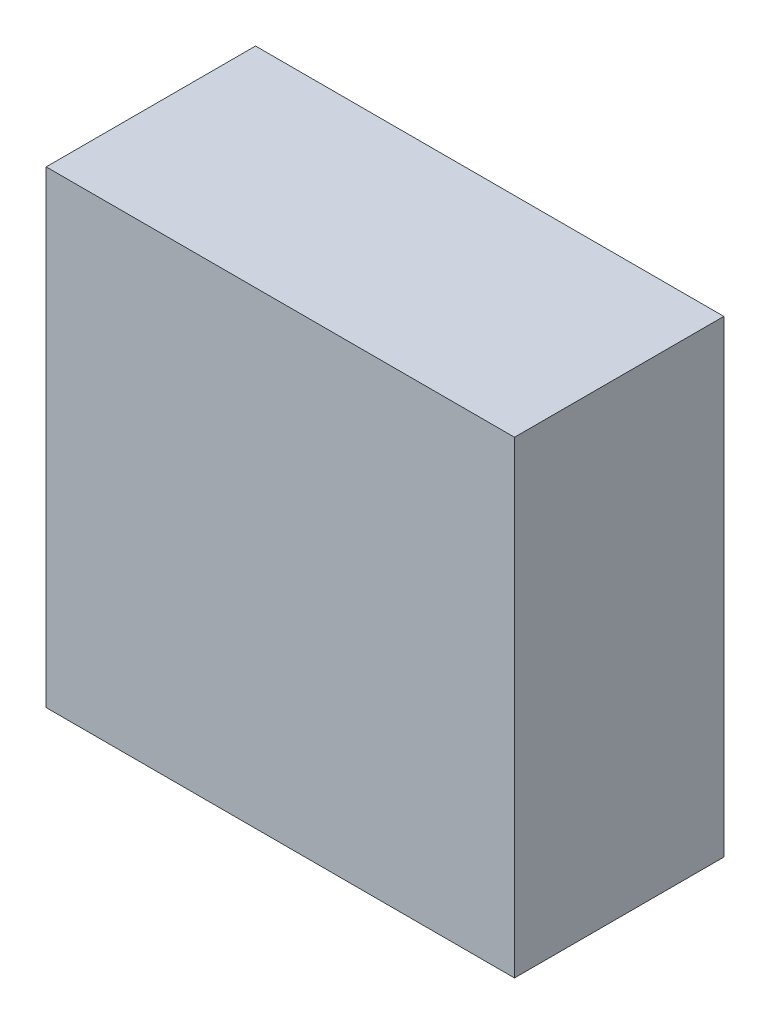
ISO-10303-21;
HEADER;
FILE_DESCRIPTION(('STEP AP214'),'2;1');
FILE_NAME('part.step','',(''),(''),'','','');
FILE_SCHEMA(('AUTOMOTIVE_DESIGN { 1 0 10303 214 1 1 1 1 }'));
ENDSEC;
DATA;
#1=APPLICATION_CONTEXT('core data for automotive mechanical design processes');
#2=APPLICATION_PROTOCOL_DEFINITION('international standard','automotive_design',2000,#1);
#3=PRODUCT_CONTEXT('',#1,'mechanical');
#4=PRODUCT('Part','Part','',(#3));
#5=PRODUCT_RELATED_PRODUCT_CATEGORY('part','',(#4));
#6=PRODUCT_DEFINITION_FORMATION('','',#4);
#7=PRODUCT_DEFINITION_CONTEXT('part definition',#1,'design');
#8=PRODUCT_DEFINITION('design','',#6,#7);
#9=PRODUCT_DEFINITION_SHAPE('','',#8);
#10=(LENGTH_UNIT() NAMED_UNIT(*) SI_UNIT(.MILLI.,.METRE.));
#11=(NAMED_UNIT(*) PLANE_ANGLE_UNIT() SI_UNIT($,.RADIAN.));
#12=(NAMED_UNIT(*) SI_UNIT($,.STERADIAN.) SOLID_ANGLE_UNIT());
#13=UNCERTAINTY_MEASURE_WITH_UNIT(LENGTH_MEASURE(1.E-05),#10,'distance_accuracy_value','');
#14=(GEOMETRIC_REPRESENTATION_CONTEXT(3) GLOBAL_UNCERTAINTY_ASSIGNED_CONTEXT((#13)) GLOBAL_UNIT_ASSIGNED_CONTEXT((#10,
#11,#12)) REPRESENTATION_CONTEXT('',''));
#15=CARTESIAN_POINT('',(0.,0.,0.));
#16=DIRECTION('',(0.,0.,1.));
#17=DIRECTION('',(1.,0.,0.));
#18=AXIS2_PLACEMENT_3D('',#15,#16,#17);
#19=CARTESIAN_POINT('',(-11.185,-11.185,10.));
#20=DIRECTION('',(1.,0.,0.));
#21=DIRECTION('',(0.,0.,-1.));
#22=AXIS2_PLACEMENT_3D('',#19,#20,#21);
#23=PLANE('',#22);
#24=DIRECTION('',(0.,-1.,0.));
#25=VECTOR('',#24,1.);
#26=CARTESIAN_POINT('',(-11.185,-11.185,0.));
#27=LINE('',#26,#25);
#28=CARTESIAN_POINT('',(-11.185,11.185,0.));
#29=VERTEX_POINT('',#28);
#30=CARTESIAN_POINT('',(-11.185,-11.185,0.));
#31=VERTEX_POINT('',#30);
#32=EDGE_CURVE('E96',#29,#31,#27,.T.);
#33=ORIENTED_EDGE('',*,*,#32,.T.);
#34=DIRECTION('',(0.,0.,-1.));
#35=VECTOR('',#34,1.);
#36=CARTESIAN_POINT('',(-11.185,-11.185,10.));
#37=LINE('',#36,#35);
#38=CARTESIAN_POINT('',(-11.185,-11.185,10.));
#39=VERTEX_POINT('',#38);
#40=EDGE_CURVE('E11',#39,#31,#37,.T.);
#41=ORIENTED_EDGE('',*,*,#40,.F.);
#42=DIRECTION('',(0.,-1.,0.));
#43=VECTOR('',#42,1.);
#44=CARTESIAN_POINT('',(-11.185,-11.185,10.));
#45=LINE('',#44,#43);
#46=CARTESIAN_POINT('',(-11.185,11.185,10.));
#47=VERTEX_POINT('',#46);
#48=EDGE_CURVE('E84',#47,#39,#45,.T.);
#49=ORIENTED_EDGE('',*,*,#48,.F.);
#50=DIRECTION('',(0.,0.,-1.));
#51=VECTOR('',#50,1.);
#52=CARTESIAN_POINT('',(-11.185,11.185,10.));
#53=LINE('',#52,#51);
#54=EDGE_CURVE('E92',#47,#29,#53,.T.);
#55=ORIENTED_EDGE('',*,*,#54,.T.);
#56=EDGE_LOOP('',(#33,#41,#49,#55));
#57=FACE_BOUND('',#56,.T.);
#58=ADVANCED_FACE('F33',(#57),#23,.F.);
#59=CARTESIAN_POINT('',(11.185,-11.185,10.));
#60=DIRECTION('',(0.,1.,0.));
#61=DIRECTION('',(-1.,0.,0.));
#62=AXIS2_PLACEMENT_3D('',#59,#60,#61);
#63=PLANE('',#62);
#64=DIRECTION('',(1.,0.,0.));
#65=VECTOR('',#64,1.);
#66=CARTESIAN_POINT('',(11.185,-11.185,0.));
#67=LINE('',#66,#65);
#68=CARTESIAN_POINT('',(11.185,-11.185,0.));
#69=VERTEX_POINT('',#68);
#70=EDGE_CURVE('E88',#31,#69,#67,.T.);
#71=ORIENTED_EDGE('',*,*,#70,.T.);
#72=DIRECTION('',(0.,0.,-1.));
#73=VECTOR('',#72,1.);
#74=CARTESIAN_POINT('',(11.185,-11.185,10.));
#75=LINE('',#74,#73);
#76=CARTESIAN_POINT('',(11.185,-11.185,10.));
#77=VERTEX_POINT('',#76);
#78=EDGE_CURVE('E41',#77,#69,#75,.T.);
#79=ORIENTED_EDGE('',*,*,#78,.F.);
#80=DIRECTION('',(1.,0.,0.));
#81=VECTOR('',#80,1.);
#82=CARTESIAN_POINT('',(11.185,-11.185,10.));
#83=LINE('',#82,#81);
#84=EDGE_CURVE('E79',#39,#77,#83,.T.);
#85=ORIENTED_EDGE('',*,*,#84,.F.);
#86=ORIENTED_EDGE('',*,*,#40,.T.);
#87=EDGE_LOOP('',(#71,#79,#85,#86));
#88=FACE_BOUND('',#87,.T.);
#89=ADVANCED_FACE('F87',(#88),#63,.F.);
#90=CARTESIAN_POINT('',(11.185,-11.185,10.));
#91=DIRECTION('',(-1.,0.,0.));
#92=DIRECTION('',(0.,0.,1.));
#93=AXIS2_PLACEMENT_3D('',#90,#91,#92);
#94=PLANE('',#93);
#95=DIRECTION('',(0.,1.,0.));
#96=VECTOR('',#95,1.);
#97=CARTESIAN_POINT('',(11.185,-11.185,0.));
#98=LINE('',#97,#96);
#99=CARTESIAN_POINT('',(11.185,11.185,0.));
#100=VERTEX_POINT('',#99);
#101=EDGE_CURVE('E66',#69,#100,#98,.T.);
#102=ORIENTED_EDGE('',*,*,#101,.T.);
#103=DIRECTION('',(0.,0.,-1.));
#104=VECTOR('',#103,1.);
#105=CARTESIAN_POINT('',(11.185,11.185,10.));
#106=LINE('',#105,#104);
#107=CARTESIAN_POINT('',(11.185,11.185,10.));
#108=VERTEX_POINT('',#107);
#109=EDGE_CURVE('E89',#108,#100,#106,.T.);
#110=ORIENTED_EDGE('',*,*,#109,.F.);
#111=DIRECTION('',(0.,1.,0.));
#112=VECTOR('',#111,1.);
#113=CARTESIAN_POINT('',(11.185,-11.185,10.));
#114=LINE('',#113,#112);
#115=EDGE_CURVE('E82',#77,#108,#114,.T.);
#116=ORIENTED_EDGE('',*,*,#115,.F.);
#117=ORIENTED_EDGE('',*,*,#78,.T.);
#118=EDGE_LOOP('',(#102,#110,#116,#117));
#119=FACE_BOUND('',#118,.T.);
#120=ADVANCED_FACE('F90',(#119),#94,.F.);
#121=CARTESIAN_POINT('',(11.185,11.185,10.));
#122=DIRECTION('',(0.,-1.,0.));
#123=DIRECTION('',(1.,0.,0.));
#124=AXIS2_PLACEMENT_3D('',#121,#122,#123);
#125=PLANE('',#124);
#126=DIRECTION('',(-1.,0.,0.));
#127=VECTOR('',#126,1.);
#128=CARTESIAN_POINT('',(11.185,11.185,0.));
#129=LINE('',#128,#127);
#130=EDGE_CURVE('E72',#100,#29,#129,.T.);
#131=ORIENTED_EDGE('',*,*,#130,.T.);
#132=ORIENTED_EDGE('',*,*,#54,.F.);
#133=DIRECTION('',(-1.,0.,0.));
#134=VECTOR('',#133,1.);
#135=CARTESIAN_POINT('',(11.185,11.185,10.));
#136=LINE('',#135,#134);
#137=EDGE_CURVE('E49',#108,#47,#136,.T.);
#138=ORIENTED_EDGE('',*,*,#137,.F.);
#139=ORIENTED_EDGE('',*,*,#109,.T.);
#140=EDGE_LOOP('',(#131,#132,#138,#139));
#141=FACE_BOUND('',#140,.T.);
#142=ADVANCED_FACE('F103',(#141),#125,.F.);
#143=CARTESIAN_POINT('',(0.,0.,10.));
#144=DIRECTION('',(0.,0.,1.));
#145=DIRECTION('',(1.,0.,0.));
#146=AXIS2_PLACEMENT_3D('',#143,#144,#145);
#147=PLANE('',#146);
#148=ORIENTED_EDGE('',*,*,#48,.T.);
#149=ORIENTED_EDGE('',*,*,#84,.T.);
#150=ORIENTED_EDGE('',*,*,#115,.T.);
#151=ORIENTED_EDGE('',*,*,#137,.T.);
#152=EDGE_LOOP('',(#148,#149,#150,#151));
#153=FACE_BOUND('',#152,.T.);
#154=ADVANCED_FACE('F80',(#153),#147,.T.);
#155=CARTESIAN_POINT('',(0.,0.,0.));
#156=DIRECTION('',(0.,0.,1.));
#157=DIRECTION('',(1.,0.,0.));
#158=AXIS2_PLACEMENT_3D('',#155,#156,#157);
#159=PLANE('',#158);
#160=ORIENTED_EDGE('',*,*,#32,.F.);
#161=ORIENTED_EDGE('',*,*,#130,.F.);
#162=ORIENTED_EDGE('',*,*,#101,.F.);
#163=ORIENTED_EDGE('',*,*,#70,.F.);
#164=EDGE_LOOP('',(#160,#161,#162,#163));
#165=FACE_BOUND('',#164,.T.);
#166=ADVANCED_FACE('F106',(#165),#159,.F.);
#167=CLOSED_SHELL('',(#58,#89,#120,#142,#154,#166));
#168=MANIFOLD_SOLID_BREP('B2',#167);
#169=ADVANCED_BREP_SHAPE_REPRESENTATION('',(#18,#168),#14);
#170=SHAPE_DEFINITION_REPRESENTATION(#9,#169);
ENDSEC;
END-ISO-10303-21;
